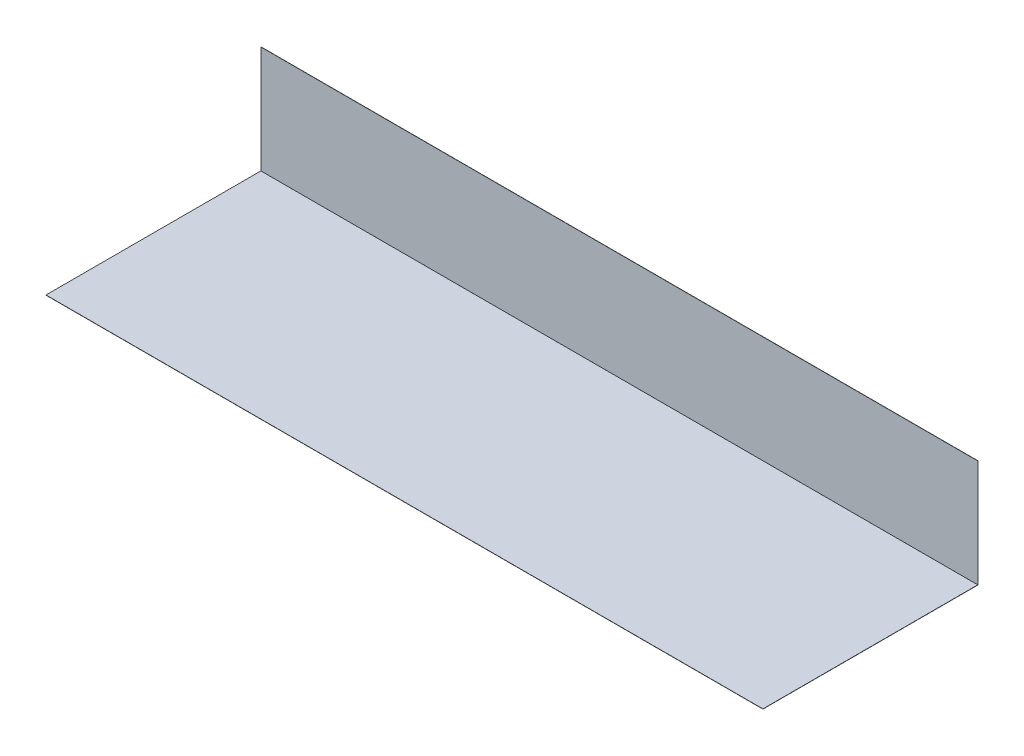
ISO-10303-21;
HEADER;
FILE_DESCRIPTION(('STEP AP214'),'2;1');
FILE_NAME('part.step','',(''),(''),'','','');
FILE_SCHEMA(('AUTOMOTIVE_DESIGN { 1 0 10303 214 1 1 1 1 }'));
ENDSEC;
DATA;
#1=APPLICATION_CONTEXT('core data for automotive mechanical design processes');
#2=APPLICATION_PROTOCOL_DEFINITION('international standard','automotive_design',2000,#1);
#3=PRODUCT_CONTEXT('',#1,'mechanical');
#4=PRODUCT('Part','Part','',(#3));
#5=PRODUCT_RELATED_PRODUCT_CATEGORY('part','',(#4));
#6=PRODUCT_DEFINITION_FORMATION('','',#4);
#7=PRODUCT_DEFINITION_CONTEXT('part definition',#1,'design');
#8=PRODUCT_DEFINITION('design','',#6,#7);
#9=PRODUCT_DEFINITION_SHAPE('','',#8);
#10=(LENGTH_UNIT() NAMED_UNIT(*) SI_UNIT(.MILLI.,.METRE.));
#11=(NAMED_UNIT(*) PLANE_ANGLE_UNIT() SI_UNIT($,.RADIAN.));
#12=(NAMED_UNIT(*) SI_UNIT($,.STERADIAN.) SOLID_ANGLE_UNIT());
#13=UNCERTAINTY_MEASURE_WITH_UNIT(LENGTH_MEASURE(1.E-05),#10,'distance_accuracy_value','');
#14=(GEOMETRIC_REPRESENTATION_CONTEXT(3) GLOBAL_UNCERTAINTY_ASSIGNED_CONTEXT((#13)) GLOBAL_UNIT_ASSIGNED_CONTEXT((#10,
#11,#12)) REPRESENTATION_CONTEXT('',''));
#15=CARTESIAN_POINT('',(0.,0.,0.));
#16=DIRECTION('',(0.,0.,1.));
#17=DIRECTION('',(1.,0.,0.));
#18=AXIS2_PLACEMENT_3D('',#15,#16,#17);
#19=CARTESIAN_POINT('',(0.,3.,1500.));
#20=DIRECTION('',(0.,-1.,0.));
#21=DIRECTION('',(1.,0.,0.));
#22=AXIS2_PLACEMENT_3D('',#19,#20,#21);
#23=PLANE('',#22);
#24=DIRECTION('',(-1.,0.,0.));
#25=VECTOR('',#24,1.);
#26=CARTESIAN_POINT('',(-10000.,2.99999999999922,-1496.9));
#27=LINE('',#26,#25);
#28=CARTESIAN_POINT('',(-10000.,2.99999999999922,-1496.9));
#29=VERTEX_POINT('',#28);
#30=CARTESIAN_POINT('',(0.,2.99999999999922,-1496.9));
#31=VERTEX_POINT('',#30);
#32=EDGE_CURVE('E181',#29,#31,#27,.F.);
#33=ORIENTED_EDGE('',*,*,#32,.F.);
#34=DIRECTION('',(0.,0.,-1.));
#35=VECTOR('',#34,1.);
#36=CARTESIAN_POINT('',(-10000.,2.99999999999878,1500.));
#37=LINE('',#36,#35);
#38=CARTESIAN_POINT('',(-10000.,2.99999999999878,1500.));
#39=VERTEX_POINT('',#38);
#40=EDGE_CURVE('E13',#39,#29,#37,.T.);
#41=ORIENTED_EDGE('',*,*,#40,.F.);
#42=DIRECTION('',(-1.,0.,0.));
#43=VECTOR('',#42,1.);
#44=CARTESIAN_POINT('',(0.,3.,1500.));
#45=LINE('',#44,#43);
#46=CARTESIAN_POINT('',(0.,3.,1500.));
#47=VERTEX_POINT('',#46);
#48=EDGE_CURVE('E189',#47,#39,#45,.T.);
#49=ORIENTED_EDGE('',*,*,#48,.F.);
#50=DIRECTION('',(0.,0.,-1.));
#51=VECTOR('',#50,1.);
#52=CARTESIAN_POINT('',(0.,3.,1500.));
#53=LINE('',#52,#51);
#54=EDGE_CURVE('E73',#47,#31,#53,.T.);
#55=ORIENTED_EDGE('',*,*,#54,.T.);
#56=EDGE_LOOP('',(#33,#41,#49,#55));
#57=FACE_BOUND('',#56,.T.);
#58=ADVANCED_FACE('F59',(#57),#23,.F.);
#59=CARTESIAN_POINT('',(-10000.,-1.22464679914735E-12,1500.));
#60=DIRECTION('',(-1.,0.,0.));
#61=DIRECTION('',(0.,0.,1.));
#62=AXIS2_PLACEMENT_3D('',#59,#60,#61);
#63=PLANE('',#62);
#64=ORIENTED_EDGE('',*,*,#40,.T.);
#65=DIRECTION('',(0.,-1.,0.));
#66=VECTOR('',#65,1.);
#67=CARTESIAN_POINT('',(-10000.,2.99999999999922,-1496.9));
#68=LINE('',#67,#66);
#69=CARTESIAN_POINT('',(-10000.,-7.75421393761633E-13,-1496.9));
#70=VERTEX_POINT('',#69);
#71=EDGE_CURVE('E175',#29,#70,#68,.T.);
#72=ORIENTED_EDGE('',*,*,#71,.T.);
#73=DIRECTION('',(0.,0.,-1.));
#74=VECTOR('',#73,1.);
#75=CARTESIAN_POINT('',(-10000.,-1.22464679914735E-12,1500.));
#76=LINE('',#75,#74);
#77=CARTESIAN_POINT('',(-10000.,-1.22464679914735E-12,1500.));
#78=VERTEX_POINT('',#77);
#79=EDGE_CURVE('E66',#78,#70,#76,.T.);
#80=ORIENTED_EDGE('',*,*,#79,.F.);
#81=DIRECTION('',(0.,1.,0.));
#82=VECTOR('',#81,1.);
#83=CARTESIAN_POINT('',(-10000.,-1.22464679914735E-12,1500.));
#84=LINE('',#83,#82);
#85=EDGE_CURVE('E193',#78,#39,#84,.T.);
#86=ORIENTED_EDGE('',*,*,#85,.T.);
#87=EDGE_LOOP('',(#64,#72,#80,#86));
#88=FACE_BOUND('',#87,.T.);
#89=ADVANCED_FACE('F205',(#88),#63,.T.);
#90=CARTESIAN_POINT('',(0.,0.,1500.));
#91=DIRECTION('',(0.,-1.,0.));
#92=DIRECTION('',(1.,0.,0.));
#93=AXIS2_PLACEMENT_3D('',#90,#91,#92);
#94=PLANE('',#93);
#95=CARTESIAN_POINT('',(-5580.10488099262,-6.83365758141414E-13,-302.876251182099));
#96=DIRECTION('',(0.,-1.,0.));
#97=DIRECTION('',(1.,0.,0.));
#98=AXIS2_PLACEMENT_3D('',#95,#96,#97);
#99=CIRCLE('',#98,124.585629419179);
#100=CARTESIAN_POINT('',(-5704.6905104118,-6.93889390390723E-13,-302.876251182099));
#101=VERTEX_POINT('',#100);
#102=EDGE_CURVE('E302',#101,#101,#99,.T.);
#103=ORIENTED_EDGE('',*,*,#102,.F.);
#104=EDGE_LOOP('',(#103));
#105=FACE_BOUND('',#104,.T.);
#106=ORIENTED_EDGE('',*,*,#79,.T.);
#107=DIRECTION('',(-1.,0.,0.));
#108=VECTOR('',#107,1.);
#109=CARTESIAN_POINT('',(-10000.,-7.75421393761633E-13,-1496.9));
#110=LINE('',#109,#108);
#111=CARTESIAN_POINT('',(0.,0.,-1496.9));
#112=VERTEX_POINT('',#111);
#113=EDGE_CURVE('E169',#70,#112,#110,.F.);
#114=ORIENTED_EDGE('',*,*,#113,.T.);
#115=DIRECTION('',(0.,0.,-1.));
#116=VECTOR('',#115,1.);
#117=CARTESIAN_POINT('',(0.,0.,1500.));
#118=LINE('',#117,#116);
#119=CARTESIAN_POINT('',(0.,0.,1500.));
#120=VERTEX_POINT('',#119);
#121=EDGE_CURVE('E81',#120,#112,#118,.T.);
#122=ORIENTED_EDGE('',*,*,#121,.F.);
#123=DIRECTION('',(-1.,0.,0.));
#124=VECTOR('',#123,1.);
#125=CARTESIAN_POINT('',(0.,0.,1500.));
#126=LINE('',#125,#124);
#127=EDGE_CURVE('E196',#120,#78,#126,.T.);
#128=ORIENTED_EDGE('',*,*,#127,.T.);
#129=EDGE_LOOP('',(#106,#114,#122,#128));
#130=FACE_BOUND('',#129,.T.);
#131=ADVANCED_FACE('F202',(#105,#130),#94,.T.);
#132=CARTESIAN_POINT('',(0.,3.,1500.));
#133=DIRECTION('',(1.,0.,0.));
#134=DIRECTION('',(0.,1.,0.));
#135=AXIS2_PLACEMENT_3D('',#132,#133,#134);
#136=PLANE('',#135);
#137=DIRECTION('',(0.,-1.,0.));
#138=VECTOR('',#137,1.);
#139=CARTESIAN_POINT('',(0.,2.99999999999922,-1496.9));
#140=LINE('',#139,#138);
#141=EDGE_CURVE('E186',#31,#112,#140,.T.);
#142=ORIENTED_EDGE('',*,*,#141,.F.);
#143=ORIENTED_EDGE('',*,*,#54,.F.);
#144=DIRECTION('',(0.,-1.,0.));
#145=VECTOR('',#144,1.);
#146=CARTESIAN_POINT('',(0.,3.,1500.));
#147=LINE('',#146,#145);
#148=EDGE_CURVE('E198',#47,#120,#147,.T.);
#149=ORIENTED_EDGE('',*,*,#148,.T.);
#150=ORIENTED_EDGE('',*,*,#121,.T.);
#151=EDGE_LOOP('',(#142,#143,#149,#150));
#152=FACE_BOUND('',#151,.T.);
#153=ADVANCED_FACE('F219',(#152),#136,.T.);
#154=CARTESIAN_POINT('',(0.,0.,1500.));
#155=DIRECTION('',(0.,0.,-1.));
#156=DIRECTION('',(-1.,0.,0.));
#157=AXIS2_PLACEMENT_3D('',#154,#155,#156);
#158=PLANE('',#157);
#159=ORIENTED_EDGE('',*,*,#48,.T.);
#160=ORIENTED_EDGE('',*,*,#85,.F.);
#161=ORIENTED_EDGE('',*,*,#127,.F.);
#162=ORIENTED_EDGE('',*,*,#148,.F.);
#163=EDGE_LOOP('',(#159,#160,#161,#162));
#164=FACE_BOUND('',#163,.T.);
#165=ADVANCED_FACE('F207',(#164),#158,.F.);
#166=CARTESIAN_POINT('',(0.,3.09999999999921,-1496.9));
#167=DIRECTION('',(1.,0.,0.));
#168=DIRECTION('',(0.,0.,-1.));
#169=AXIS2_PLACEMENT_3D('',#166,#167,#168);
#170=PLANE('',#169);
#171=DIRECTION('',(0.,0.,1.));
#172=VECTOR('',#171,1.);
#173=CARTESIAN_POINT('',(0.,3.0999999999999,-1500.));
#174=LINE('',#173,#172);
#175=CARTESIAN_POINT('',(0.,3.09999999999988,-1497.));
#176=VERTEX_POINT('',#175);
#177=CARTESIAN_POINT('',(0.,3.10000000001989,-1500.));
#178=VERTEX_POINT('',#177);
#179=EDGE_CURVE('E151',#176,#178,#174,.F.);
#180=ORIENTED_EDGE('',*,*,#179,.F.);
#181=CARTESIAN_POINT('',(0.,3.09999999999921,-1496.9));
#182=DIRECTION('',(-1.,0.,0.));
#183=DIRECTION('',(0.,0.,1.));
#184=AXIS2_PLACEMENT_3D('',#181,#182,#183);
#185=CIRCLE('',#184,0.099999999999989);
#186=EDGE_CURVE('E178',#31,#176,#185,.F.);
#187=ORIENTED_EDGE('',*,*,#186,.F.);
#188=ORIENTED_EDGE('',*,*,#141,.T.);
#189=CARTESIAN_POINT('',(0.,3.09999999999921,-1496.9));
#190=DIRECTION('',(-1.,0.,0.));
#191=DIRECTION('',(0.,0.,1.));
#192=AXIS2_PLACEMENT_3D('',#189,#190,#191);
#193=CIRCLE('',#192,3.09999999999999);
#194=EDGE_CURVE('E171',#112,#178,#193,.F.);
#195=ORIENTED_EDGE('',*,*,#194,.T.);
#196=EDGE_LOOP('',(#180,#187,#188,#195));
#197=FACE_BOUND('',#196,.T.);
#198=ADVANCED_FACE('F218',(#197),#170,.T.);
#199=CARTESIAN_POINT('',(-10000.,3.09999999999921,-1496.9));
#200=DIRECTION('',(1.,0.,0.));
#201=DIRECTION('',(0.,0.,-1.));
#202=AXIS2_PLACEMENT_3D('',#199,#200,#201);
#203=PLANE('',#202);
#204=CARTESIAN_POINT('',(-10000.,3.09999999999921,-1496.9));
#205=DIRECTION('',(-1.,0.,0.));
#206=DIRECTION('',(0.,0.,1.));
#207=AXIS2_PLACEMENT_3D('',#204,#205,#206);
#208=CIRCLE('',#207,0.099999999999989);
#209=CARTESIAN_POINT('',(-10000.,3.09999999999988,-1497.));
#210=VERTEX_POINT('',#209);
#211=EDGE_CURVE('E183',#210,#29,#208,.T.);
#212=ORIENTED_EDGE('',*,*,#211,.F.);
#213=DIRECTION('',(0.,0.,1.));
#214=VECTOR('',#213,1.);
#215=CARTESIAN_POINT('',(-10000.,3.09999999999855,-1497.));
#216=LINE('',#215,#214);
#217=CARTESIAN_POINT('',(-10000.,3.09999999999857,-1500.));
#218=VERTEX_POINT('',#217);
#219=EDGE_CURVE('E162',#210,#218,#216,.F.);
#220=ORIENTED_EDGE('',*,*,#219,.T.);
#221=CARTESIAN_POINT('',(-10000.,3.09999999999921,-1496.9));
#222=DIRECTION('',(-1.,0.,0.));
#223=DIRECTION('',(0.,0.,1.));
#224=AXIS2_PLACEMENT_3D('',#221,#222,#223);
#225=CIRCLE('',#224,3.09999999999999);
#226=EDGE_CURVE('E172',#218,#70,#225,.T.);
#227=ORIENTED_EDGE('',*,*,#226,.T.);
#228=ORIENTED_EDGE('',*,*,#71,.F.);
#229=EDGE_LOOP('',(#212,#220,#227,#228));
#230=FACE_BOUND('',#229,.T.);
#231=ADVANCED_FACE('F288',(#230),#203,.F.);
#232=CARTESIAN_POINT('',(-10000.,3.09999999999921,-1496.9));
#233=DIRECTION('',(-1.,0.,0.));
#234=DIRECTION('',(0.,0.,-1.));
#235=AXIS2_PLACEMENT_3D('',#232,#233,#234);
#236=CYLINDRICAL_SURFACE('',#235,3.09999999999999);
#237=ORIENTED_EDGE('',*,*,#113,.F.);
#238=ORIENTED_EDGE('',*,*,#226,.F.);
#239=DIRECTION('',(-1.,0.,0.));
#240=VECTOR('',#239,1.);
#241=CARTESIAN_POINT('',(0.,3.0999999999999,-1500.));
#242=LINE('',#241,#240);
#243=EDGE_CURVE('E160',#218,#178,#242,.F.);
#244=ORIENTED_EDGE('',*,*,#243,.T.);
#245=ORIENTED_EDGE('',*,*,#194,.F.);
#246=EDGE_LOOP('',(#237,#238,#244,#245));
#247=FACE_BOUND('',#246,.T.);
#248=ADVANCED_FACE('F285',(#247),#236,.T.);
#249=CARTESIAN_POINT('',(-10000.,3.09999999999921,-1496.9));
#250=DIRECTION('',(-1.,0.,0.));
#251=DIRECTION('',(0.,0.,-1.));
#252=AXIS2_PLACEMENT_3D('',#249,#250,#251);
#253=CYLINDRICAL_SURFACE('',#252,0.099999999999989);
#254=ORIENTED_EDGE('',*,*,#32,.T.);
#255=ORIENTED_EDGE('',*,*,#186,.T.);
#256=DIRECTION('',(-1.,0.,0.));
#257=VECTOR('',#256,1.);
#258=CARTESIAN_POINT('',(0.,3.09999999999988,-1497.));
#259=LINE('',#258,#257);
#260=EDGE_CURVE('E165',#176,#210,#259,.T.);
#261=ORIENTED_EDGE('',*,*,#260,.T.);
#262=ORIENTED_EDGE('',*,*,#211,.T.);
#263=EDGE_LOOP('',(#254,#255,#261,#262));
#264=FACE_BOUND('',#263,.T.);
#265=ADVANCED_FACE('F214',(#264),#253,.F.);
#266=CARTESIAN_POINT('',(0.,2.99999999999999,-1500.));
#267=DIRECTION('',(-1.,0.,0.));
#268=DIRECTION('',(0.,-1.,0.));
#269=AXIS2_PLACEMENT_3D('',#266,#267,#268);
#270=PLANE('',#269);
#271=ORIENTED_EDGE('',*,*,#179,.T.);
#272=DIRECTION('',(0.,-1.,0.));
#273=VECTOR('',#272,1.);
#274=CARTESIAN_POINT('',(0.,-5.35022446225375E-12,-1500.));
#275=LINE('',#274,#273);
#276=CARTESIAN_POINT('',(-1.8370720590971E-13,1500.,-1500.00000000001));
#277=VERTEX_POINT('',#276);
#278=EDGE_CURVE('E132',#277,#178,#275,.T.);
#279=ORIENTED_EDGE('',*,*,#278,.F.);
#280=DIRECTION('',(0.,0.,1.));
#281=VECTOR('',#280,1.);
#282=CARTESIAN_POINT('',(-1.83707195713476E-13,1500.,-1500.00000000001));
#283=LINE('',#282,#281);
#284=CARTESIAN_POINT('',(-1.83707195713476E-13,1500.,-1497.00000000001));
#285=VERTEX_POINT('',#284);
#286=EDGE_CURVE('E138',#277,#285,#283,.T.);
#287=ORIENTED_EDGE('',*,*,#286,.T.);
#288=DIRECTION('',(0.,1.,0.));
#289=VECTOR('',#288,1.);
#290=CARTESIAN_POINT('',(0.,3.,-1497.));
#291=LINE('',#290,#289);
#292=EDGE_CURVE('E158',#285,#176,#291,.F.);
#293=ORIENTED_EDGE('',*,*,#292,.T.);
#294=EDGE_LOOP('',(#271,#279,#287,#293));
#295=FACE_BOUND('',#294,.T.);
#296=ADVANCED_FACE('F150',(#295),#270,.F.);
#297=CARTESIAN_POINT('',(-10000.,1500.,-1500.00000000001));
#298=DIRECTION('',(1.,0.,0.));
#299=DIRECTION('',(0.,0.,-1.));
#300=AXIS2_PLACEMENT_3D('',#297,#298,#299);
#301=PLANE('',#300);
#302=ORIENTED_EDGE('',*,*,#219,.F.);
#303=DIRECTION('',(0.,-1.,0.));
#304=VECTOR('',#303,1.);
#305=CARTESIAN_POINT('',(-10000.,1500.,-1497.00000000001));
#306=LINE('',#305,#304);
#307=CARTESIAN_POINT('',(-10000.,1500.,-1497.00000000001));
#308=VERTEX_POINT('',#307);
#309=EDGE_CURVE('E154',#210,#308,#306,.F.);
#310=ORIENTED_EDGE('',*,*,#309,.T.);
#311=DIRECTION('',(0.,0.,1.));
#312=VECTOR('',#311,1.);
#313=CARTESIAN_POINT('',(-10000.,1500.,-1500.00000000001));
#314=LINE('',#313,#312);
#315=CARTESIAN_POINT('',(-10000.,1500.,-1500.00000000001));
#316=VERTEX_POINT('',#315);
#317=EDGE_CURVE('E147',#316,#308,#314,.T.);
#318=ORIENTED_EDGE('',*,*,#317,.F.);
#319=DIRECTION('',(0.,1.,0.));
#320=VECTOR('',#319,1.);
#321=CARTESIAN_POINT('',(-10000.,-5.35022446225375E-12,-1500.));
#322=LINE('',#321,#320);
#323=EDGE_CURVE('E134',#218,#316,#322,.T.);
#324=ORIENTED_EDGE('',*,*,#323,.F.);
#325=EDGE_LOOP('',(#302,#310,#318,#324));
#326=FACE_BOUND('',#325,.T.);
#327=ADVANCED_FACE('F275',(#326),#301,.F.);
#328=CARTESIAN_POINT('',(0.,-5.35022446225375E-12,-1500.));
#329=DIRECTION('',(0.,0.,1.));
#330=DIRECTION('',(0.,-1.,0.));
#331=AXIS2_PLACEMENT_3D('',#328,#329,#330);
#332=PLANE('',#331);
#333=ORIENTED_EDGE('',*,*,#243,.F.);
#334=ORIENTED_EDGE('',*,*,#323,.T.);
#335=DIRECTION('',(1.,0.,0.));
#336=VECTOR('',#335,1.);
#337=CARTESIAN_POINT('',(-1.99840144432528E-13,1500.,-1500.00000000001));
#338=LINE('',#337,#336);
#339=EDGE_CURVE('E127',#316,#277,#338,.T.);
#340=ORIENTED_EDGE('',*,*,#339,.T.);
#341=ORIENTED_EDGE('',*,*,#278,.T.);
#342=EDGE_LOOP('',(#333,#334,#340,#341));
#343=FACE_BOUND('',#342,.T.);
#344=ADVANCED_FACE('F130',(#343),#332,.F.);
#345=CARTESIAN_POINT('',(0.,-5.33975001823723E-12,-1497.));
#346=DIRECTION('',(0.,0.,1.));
#347=DIRECTION('',(0.,-1.,0.));
#348=AXIS2_PLACEMENT_3D('',#345,#346,#347);
#349=PLANE('',#348);
#350=ORIENTED_EDGE('',*,*,#309,.F.);
#351=ORIENTED_EDGE('',*,*,#260,.F.);
#352=ORIENTED_EDGE('',*,*,#292,.F.);
#353=DIRECTION('',(-1.,0.,0.));
#354=VECTOR('',#353,1.);
#355=CARTESIAN_POINT('',(-1.83707195713476E-13,1500.,-1497.00000000001));
#356=LINE('',#355,#354);
#357=EDGE_CURVE('E143',#308,#285,#356,.F.);
#358=ORIENTED_EDGE('',*,*,#357,.F.);
#359=EDGE_LOOP('',(#350,#351,#352,#358));
#360=FACE_BOUND('',#359,.T.);
#361=ADVANCED_FACE('F274',(#360),#349,.T.);
#362=CARTESIAN_POINT('',(-1.83707195713476E-13,1500.,-1500.00000000001));
#363=DIRECTION('',(0.,-1.,0.));
#364=DIRECTION('',(0.,0.,-1.));
#365=AXIS2_PLACEMENT_3D('',#362,#363,#364);
#366=PLANE('',#365);
#367=ORIENTED_EDGE('',*,*,#357,.T.);
#368=ORIENTED_EDGE('',*,*,#286,.F.);
#369=ORIENTED_EDGE('',*,*,#339,.F.);
#370=ORIENTED_EDGE('',*,*,#317,.T.);
#371=EDGE_LOOP('',(#367,#368,#369,#370));
#372=FACE_BOUND('',#371,.T.);
#373=ADVANCED_FACE('F141',(#372),#366,.F.);
#374=CARTESIAN_POINT('',(-5580.10488099262,-100.000000000001,-302.876251182099));
#375=DIRECTION('',(0.,1.,0.));
#376=DIRECTION('',(-1.,0.,0.));
#377=AXIS2_PLACEMENT_3D('',#374,#375,#376);
#378=CYLINDRICAL_SURFACE('',#377,124.585629419179);
#379=CARTESIAN_POINT('',(-5580.10488099262,-100.000000000001,-302.876251182099));
#380=DIRECTION('',(0.,-1.,0.));
#381=DIRECTION('',(1.,0.,0.));
#382=AXIS2_PLACEMENT_3D('',#379,#380,#381);
#383=CIRCLE('',#382,124.585629419179);
#384=CARTESIAN_POINT('',(-5704.6905104118,-100.000000000001,-302.876251182099));
#385=VERTEX_POINT('',#384);
#386=EDGE_CURVE('E168',#385,#385,#383,.T.);
#387=CARTESIAN_POINT('',(-5704.6905104118,-100.000000000001,-302.876251182099));
#388=CARTESIAN_POINT('',(-5704.6905104118,-98.958333333334,-302.876251182099));
#389=CARTESIAN_POINT('',(-5704.6905104118,-97.9166666666674,-302.876251182099));
#390=CARTESIAN_POINT('',(-5704.6905104118,-95.833333333334,-302.876251182099));
#391=CARTESIAN_POINT('',(-5704.6905104118,-94.7916666666674,-302.876251182099));
#392=CARTESIAN_POINT('',(-5704.6905104118,-92.708333333334,-302.876251182099));
#393=CARTESIAN_POINT('',(-5704.6905104118,-91.6666666666674,-302.876251182099));
#394=CARTESIAN_POINT('',(-5704.6905104118,-89.583333333334,-302.876251182099));
#395=CARTESIAN_POINT('',(-5704.6905104118,-88.5416666666674,-302.876251182099));
#396=CARTESIAN_POINT('',(-5704.6905104118,-86.458333333334,-302.876251182099));
#397=CARTESIAN_POINT('',(-5704.6905104118,-85.4166666666674,-302.876251182099));
#398=CARTESIAN_POINT('',(-5704.6905104118,-83.333333333334,-302.876251182099));
#399=CARTESIAN_POINT('',(-5704.6905104118,-82.2916666666674,-302.876251182099));
#400=CARTESIAN_POINT('',(-5704.6905104118,-80.208333333334,-302.876251182099));
#401=CARTESIAN_POINT('',(-5704.6905104118,-79.1666666666674,-302.876251182099));
#402=CARTESIAN_POINT('',(-5704.6905104118,-77.083333333334,-302.876251182099));
#403=CARTESIAN_POINT('',(-5704.6905104118,-76.0416666666674,-302.876251182099));
#404=CARTESIAN_POINT('',(-5704.6905104118,-73.958333333334,-302.876251182099));
#405=CARTESIAN_POINT('',(-5704.6905104118,-72.9166666666674,-302.876251182099));
#406=CARTESIAN_POINT('',(-5704.6905104118,-70.833333333334,-302.876251182099));
#407=CARTESIAN_POINT('',(-5704.6905104118,-69.7916666666674,-302.876251182099));
#408=CARTESIAN_POINT('',(-5704.6905104118,-67.708333333334,-302.876251182099));
#409=CARTESIAN_POINT('',(-5704.6905104118,-66.6666666666674,-302.876251182099));
#410=CARTESIAN_POINT('',(-5704.6905104118,-64.583333333334,-302.876251182099));
#411=CARTESIAN_POINT('',(-5704.6905104118,-63.5416666666674,-302.876251182099));
#412=CARTESIAN_POINT('',(-5704.6905104118,-61.458333333334,-302.876251182099));
#413=CARTESIAN_POINT('',(-5704.6905104118,-60.4166666666674,-302.876251182099));
#414=CARTESIAN_POINT('',(-5704.6905104118,-58.333333333334,-302.876251182099));
#415=CARTESIAN_POINT('',(-5704.6905104118,-57.2916666666674,-302.876251182099));
#416=CARTESIAN_POINT('',(-5704.6905104118,-55.208333333334,-302.876251182099));
#417=CARTESIAN_POINT('',(-5704.6905104118,-54.1666666666674,-302.876251182099));
#418=CARTESIAN_POINT('',(-5704.6905104118,-52.083333333334,-302.876251182099));
#419=CARTESIAN_POINT('',(-5704.6905104118,-51.0416666666674,-302.876251182099));
#420=CARTESIAN_POINT('',(-5704.6905104118,-48.958333333334,-302.876251182099));
#421=CARTESIAN_POINT('',(-5704.6905104118,-47.9166666666674,-302.876251182099));
#422=CARTESIAN_POINT('',(-5704.6905104118,-45.833333333334,-302.876251182099));
#423=CARTESIAN_POINT('',(-5704.6905104118,-44.7916666666674,-302.876251182099));
#424=CARTESIAN_POINT('',(-5704.6905104118,-42.708333333334,-302.876251182099));
#425=CARTESIAN_POINT('',(-5704.6905104118,-41.6666666666674,-302.876251182099));
#426=CARTESIAN_POINT('',(-5704.6905104118,-39.583333333334,-302.876251182099));
#427=CARTESIAN_POINT('',(-5704.6905104118,-38.5416666666674,-302.876251182099));
#428=CARTESIAN_POINT('',(-5704.6905104118,-36.458333333334,-302.876251182099));
#429=CARTESIAN_POINT('',(-5704.6905104118,-35.4166666666674,-302.876251182099));
#430=CARTESIAN_POINT('',(-5704.6905104118,-33.333333333334,-302.876251182099));
#431=CARTESIAN_POINT('',(-5704.6905104118,-32.2916666666674,-302.876251182099));
#432=CARTESIAN_POINT('',(-5704.6905104118,-30.208333333334,-302.876251182099));
#433=CARTESIAN_POINT('',(-5704.6905104118,-29.1666666666674,-302.876251182099));
#434=CARTESIAN_POINT('',(-5704.6905104118,-27.083333333334,-302.876251182099));
#435=CARTESIAN_POINT('',(-5704.6905104118,-26.0416666666674,-302.876251182099));
#436=CARTESIAN_POINT('',(-5704.6905104118,-23.958333333334,-302.876251182099));
#437=CARTESIAN_POINT('',(-5704.6905104118,-22.9166666666674,-302.876251182099));
#438=CARTESIAN_POINT('',(-5704.6905104118,-20.833333333334,-302.876251182099));
#439=CARTESIAN_POINT('',(-5704.6905104118,-19.7916666666674,-302.876251182099));
#440=CARTESIAN_POINT('',(-5704.6905104118,-17.708333333334,-302.876251182099));
#441=CARTESIAN_POINT('',(-5704.6905104118,-16.6666666666674,-302.876251182099));
#442=CARTESIAN_POINT('',(-5704.6905104118,-14.583333333334,-302.876251182099));
#443=CARTESIAN_POINT('',(-5704.6905104118,-13.5416666666674,-302.876251182099));
#444=CARTESIAN_POINT('',(-5704.6905104118,-11.458333333334,-302.876251182099));
#445=CARTESIAN_POINT('',(-5704.6905104118,-10.4166666666674,-302.876251182099));
#446=CARTESIAN_POINT('',(-5704.6905104118,-8.33333333333402,-302.876251182099));
#447=CARTESIAN_POINT('',(-5704.6905104118,-7.29166666666736,-302.876251182099));
#448=CARTESIAN_POINT('',(-5704.6905104118,-5.20833333333403,-302.876251182099));
#449=CARTESIAN_POINT('',(-5704.6905104118,-4.16666666666736,-302.876251182099));
#450=CARTESIAN_POINT('',(-5704.6905104118,-2.08333333333403,-302.876251182099));
#451=CARTESIAN_POINT('',(-5704.6905104118,-1.04166666666736,-302.876251182099));
#452=CARTESIAN_POINT('',(-5704.6905104118,-6.93889390390723E-13,-302.876251182099));
#453=B_SPLINE_CURVE_WITH_KNOTS('',3,(#387,#388,#389,#390,#391,#392,#393,#394,#395,#396,#397,
#398,#399,#400,#401,#402,#403,#404,#405,#406,#407,#408,#409,#410,#411,#412,#413,#414,#415,#416,
#417,#418,#419,#420,#421,#422,#423,#424,#425,#426,#427,#428,#429,#430,#431,#432,#433,#434,#435,
#436,#437,#438,#439,#440,#441,#442,#443,#444,#445,#446,#447,#448,#449,#450,#451,#452),
.UNSPECIFIED.,.F.,.F.,(4,2,2,2,2,2,2,2,2,2,2,2,2,2,2,2,2,2,2,2,2,2,2,2,2,2,2,2,2,2,2,2,4),(0.,
3.12499999999999,6.24999999999999,9.37499999999999,12.5,15.625,18.75,21.875,25.,28.125,31.25,
34.375,37.5,40.625,43.75,46.875,50.,53.125,56.25,59.375,62.5,65.625,68.75,71.875,75.,78.125,
81.25,84.375,87.5,90.625,93.75,96.875,100.),.UNSPECIFIED.);
#454=EDGE_CURVE('BSEAM251',#385,#101,#453,.T.);
#455=ORIENTED_EDGE('',*,*,#386,.F.);
#456=ORIENTED_EDGE('',*,*,#102,.T.);
#457=ORIENTED_EDGE('',*,*,#454,.T.);
#458=ORIENTED_EDGE('',*,*,#454,.F.);
#459=EDGE_LOOP('',(#455,#457,#456,#458));
#460=FACE_BOUND('',#459,.T.);
#461=ADVANCED_FACE('F251',(#460),#378,.T.);
#462=CARTESIAN_POINT('',(-5580.10488099262,-100.000000000001,-302.876251182099));
#463=DIRECTION('',(0.,-1.,0.));
#464=DIRECTION('',(1.,0.,0.));
#465=AXIS2_PLACEMENT_3D('',#462,#463,#464);
#466=PLANE('',#465);
#467=ORIENTED_EDGE('',*,*,#386,.T.);
#468=EDGE_LOOP('',(#467));
#469=FACE_BOUND('',#468,.T.);
#470=ADVANCED_FACE('F256',(#469),#466,.T.);
#471=CLOSED_SHELL('',(#58,#89,#131,#153,#165,#198,#231,#248,#265,#296,#327,#344,#361,#373,#461,#470));
#472=MANIFOLD_SOLID_BREP('B2',#471);
#473=ADVANCED_BREP_SHAPE_REPRESENTATION('',(#18,#472),#14);
#474=SHAPE_DEFINITION_REPRESENTATION(#9,#473);
ENDSEC;
END-ISO-10303-21;
